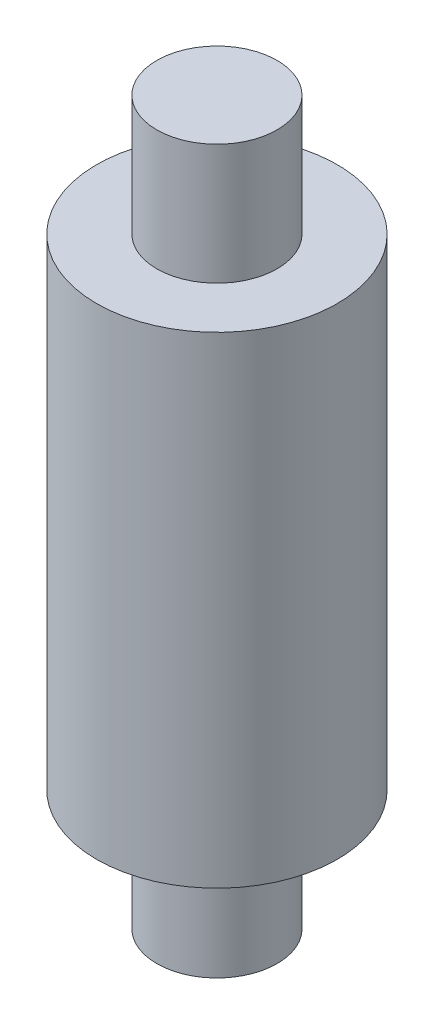
ISO-10303-21;
HEADER;
FILE_DESCRIPTION(('STEP AP214'),'2;1');
FILE_NAME('part.step','',(''),(''),'','','');
FILE_SCHEMA(('AUTOMOTIVE_DESIGN { 1 0 10303 214 1 1 1 1 }'));
ENDSEC;
DATA;
#1=APPLICATION_CONTEXT('core data for automotive mechanical design processes');
#2=APPLICATION_PROTOCOL_DEFINITION('international standard','automotive_design',2000,#1);
#3=PRODUCT_CONTEXT('',#1,'mechanical');
#4=PRODUCT('Part','Part','',(#3));
#5=PRODUCT_RELATED_PRODUCT_CATEGORY('part','',(#4));
#6=PRODUCT_DEFINITION_FORMATION('','',#4);
#7=PRODUCT_DEFINITION_CONTEXT('part definition',#1,'design');
#8=PRODUCT_DEFINITION('design','',#6,#7);
#9=PRODUCT_DEFINITION_SHAPE('','',#8);
#10=(LENGTH_UNIT() NAMED_UNIT(*) SI_UNIT(.MILLI.,.METRE.));
#11=(NAMED_UNIT(*) PLANE_ANGLE_UNIT() SI_UNIT($,.RADIAN.));
#12=(NAMED_UNIT(*) SI_UNIT($,.STERADIAN.) SOLID_ANGLE_UNIT());
#13=UNCERTAINTY_MEASURE_WITH_UNIT(LENGTH_MEASURE(1.E-05),#10,'distance_accuracy_value','');
#14=(GEOMETRIC_REPRESENTATION_CONTEXT(3) GLOBAL_UNCERTAINTY_ASSIGNED_CONTEXT((#13)) GLOBAL_UNIT_ASSIGNED_CONTEXT((#10,
#11,#12)) REPRESENTATION_CONTEXT('',''));
#15=CARTESIAN_POINT('',(0.,0.,0.));
#16=DIRECTION('',(0.,0.,1.));
#17=DIRECTION('',(1.,0.,0.));
#18=AXIS2_PLACEMENT_3D('',#15,#16,#17);
#19=CARTESIAN_POINT('',(0.,2.,0.));
#20=DIRECTION('',(0.,-1.,0.));
#21=DIRECTION('',(0.,0.,-1.));
#22=AXIS2_PLACEMENT_3D('',#19,#20,#21);
#23=CYLINDRICAL_SURFACE('',#22,1.);
#24=CARTESIAN_POINT('',(0.,2.,0.));
#25=DIRECTION('',(0.,1.,0.));
#26=DIRECTION('',(0.,0.,1.));
#27=AXIS2_PLACEMENT_3D('',#24,#25,#26);
#28=CIRCLE('',#27,1.);
#29=CARTESIAN_POINT('',(0.,2.,1.));
#30=VERTEX_POINT('',#29);
#31=EDGE_CURVE('E39',#30,#30,#28,.T.);
#32=ORIENTED_EDGE('',*,*,#31,.F.);
#33=EDGE_LOOP('',(#32));
#34=FACE_BOUND('',#33,.T.);
#35=CARTESIAN_POINT('',(0.,0.,0.));
#36=DIRECTION('',(0.,1.,0.));
#37=DIRECTION('',(0.,0.,1.));
#38=AXIS2_PLACEMENT_3D('',#35,#36,#37);
#39=CIRCLE('',#38,1.);
#40=CARTESIAN_POINT('',(0.,0.,1.));
#41=VERTEX_POINT('',#40);
#42=EDGE_CURVE('E35',#41,#41,#39,.T.);
#43=ORIENTED_EDGE('',*,*,#42,.T.);
#44=EDGE_LOOP('',(#43));
#45=FACE_BOUND('',#44,.T.);
#46=ADVANCED_FACE('F32',(#34,#45),#23,.T.);
#47=CARTESIAN_POINT('',(0.,0.,0.));
#48=DIRECTION('',(0.,1.,0.));
#49=DIRECTION('',(0.,0.,1.));
#50=AXIS2_PLACEMENT_3D('',#47,#48,#49);
#51=PLANE('',#50);
#52=ORIENTED_EDGE('',*,*,#42,.F.);
#53=EDGE_LOOP('',(#52));
#54=FACE_BOUND('',#53,.T.);
#55=ADVANCED_FACE('F73',(#54),#51,.F.);
#56=CARTESIAN_POINT('',(0.,10.,0.));
#57=DIRECTION('',(0.,-1.,0.));
#58=DIRECTION('',(0.,0.,-1.));
#59=AXIS2_PLACEMENT_3D('',#56,#57,#58);
#60=CYLINDRICAL_SURFACE('',#59,2.);
#61=CARTESIAN_POINT('',(0.,10.,0.));
#62=DIRECTION('',(0.,1.,0.));
#63=DIRECTION('',(0.,0.,1.));
#64=AXIS2_PLACEMENT_3D('',#61,#62,#63);
#65=CIRCLE('',#64,2.);
#66=CARTESIAN_POINT('',(0.,10.,2.));
#67=VERTEX_POINT('',#66);
#68=EDGE_CURVE('E47',#67,#67,#65,.T.);
#69=ORIENTED_EDGE('',*,*,#68,.F.);
#70=EDGE_LOOP('',(#69));
#71=FACE_BOUND('',#70,.T.);
#72=CARTESIAN_POINT('',(0.,2.,0.));
#73=DIRECTION('',(0.,1.,0.));
#74=DIRECTION('',(0.,0.,1.));
#75=AXIS2_PLACEMENT_3D('',#72,#73,#74);
#76=CIRCLE('',#75,2.);
#77=CARTESIAN_POINT('',(0.,2.,2.));
#78=VERTEX_POINT('',#77);
#79=EDGE_CURVE('E50',#78,#78,#76,.T.);
#80=ORIENTED_EDGE('',*,*,#79,.T.);
#81=EDGE_LOOP('',(#80));
#82=FACE_BOUND('',#81,.T.);
#83=ADVANCED_FACE('F78',(#71,#82),#60,.T.);
#84=CARTESIAN_POINT('',(0.,10.,0.));
#85=DIRECTION('',(0.,1.,0.));
#86=DIRECTION('',(0.,0.,1.));
#87=AXIS2_PLACEMENT_3D('',#84,#85,#86);
#88=PLANE('',#87);
#89=CARTESIAN_POINT('',(0.,10.,0.));
#90=DIRECTION('',(0.,1.,0.));
#91=DIRECTION('',(0.,0.,1.));
#92=AXIS2_PLACEMENT_3D('',#89,#90,#91);
#93=CIRCLE('',#92,1.);
#94=CARTESIAN_POINT('',(0.,10.,1.));
#95=VERTEX_POINT('',#94);
#96=EDGE_CURVE('E10',#95,#95,#93,.T.);
#97=ORIENTED_EDGE('',*,*,#96,.F.);
#98=EDGE_LOOP('',(#97));
#99=FACE_BOUND('',#98,.T.);
#100=ORIENTED_EDGE('',*,*,#68,.T.);
#101=EDGE_LOOP('',(#100));
#102=FACE_BOUND('',#101,.T.);
#103=ADVANCED_FACE('F68',(#99,#102),#88,.T.);
#104=CARTESIAN_POINT('',(0.,2.,0.));
#105=DIRECTION('',(0.,1.,0.));
#106=DIRECTION('',(0.,0.,1.));
#107=AXIS2_PLACEMENT_3D('',#104,#105,#106);
#108=PLANE('',#107);
#109=ORIENTED_EDGE('',*,*,#31,.T.);
#110=EDGE_LOOP('',(#109));
#111=FACE_BOUND('',#110,.T.);
#112=ORIENTED_EDGE('',*,*,#79,.F.);
#113=EDGE_LOOP('',(#112));
#114=FACE_BOUND('',#113,.T.);
#115=ADVANCED_FACE('F61',(#111,#114),#108,.F.);
#116=CARTESIAN_POINT('',(0.,12.,0.));
#117=DIRECTION('',(0.,-1.,0.));
#118=DIRECTION('',(0.,0.,-1.));
#119=AXIS2_PLACEMENT_3D('',#116,#117,#118);
#120=CYLINDRICAL_SURFACE('',#119,1.);
#121=CARTESIAN_POINT('',(0.,12.,0.));
#122=DIRECTION('',(0.,1.,0.));
#123=DIRECTION('',(0.,0.,1.));
#124=AXIS2_PLACEMENT_3D('',#121,#122,#123);
#125=CIRCLE('',#124,1.);
#126=CARTESIAN_POINT('',(0.,12.,1.));
#127=VERTEX_POINT('',#126);
#128=EDGE_CURVE('E46',#127,#127,#125,.T.);
#129=ORIENTED_EDGE('',*,*,#128,.F.);
#130=EDGE_LOOP('',(#129));
#131=FACE_BOUND('',#130,.T.);
#132=ORIENTED_EDGE('',*,*,#96,.T.);
#133=EDGE_LOOP('',(#132));
#134=FACE_BOUND('',#133,.T.);
#135=ADVANCED_FACE('F59',(#131,#134),#120,.T.);
#136=CARTESIAN_POINT('',(0.,12.,0.));
#137=DIRECTION('',(0.,1.,0.));
#138=DIRECTION('',(0.,0.,1.));
#139=AXIS2_PLACEMENT_3D('',#136,#137,#138);
#140=PLANE('',#139);
#141=ORIENTED_EDGE('',*,*,#128,.T.);
#142=EDGE_LOOP('',(#141));
#143=FACE_BOUND('',#142,.T.);
#144=ADVANCED_FACE('F57',(#143),#140,.T.);
#145=CLOSED_SHELL('',(#46,#55,#83,#103,#115,#135,#144));
#146=MANIFOLD_SOLID_BREP('B2',#145);
#147=ADVANCED_BREP_SHAPE_REPRESENTATION('',(#18,#146),#14);
#148=SHAPE_DEFINITION_REPRESENTATION(#9,#147);
ENDSEC;
END-ISO-10303-21;
